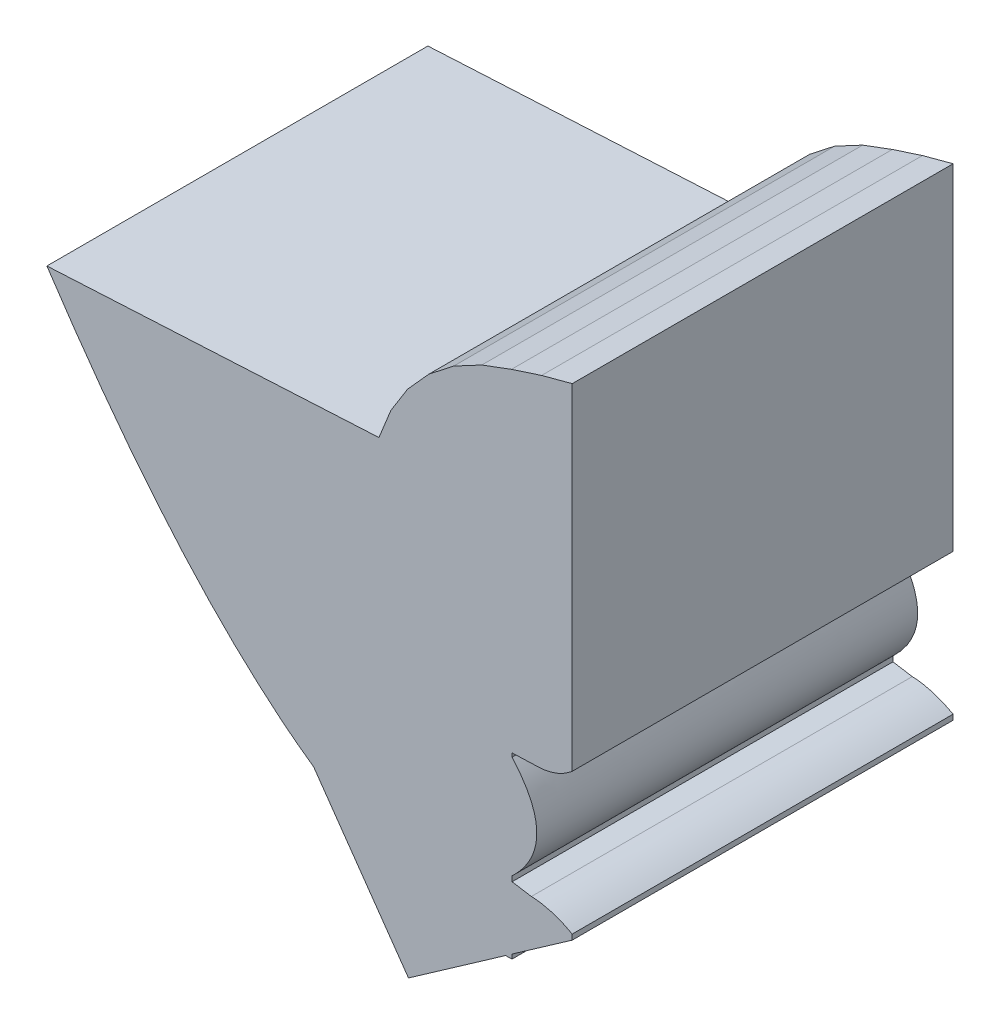
ISO-10303-21;
HEADER;
FILE_DESCRIPTION(('STEP AP214'),'2;1');
FILE_NAME('part.step','',(''),(''),'','','');
FILE_SCHEMA(('AUTOMOTIVE_DESIGN { 1 0 10303 214 1 1 1 1 }'));
ENDSEC;
DATA;
#1=APPLICATION_CONTEXT('core data for automotive mechanical design processes');
#2=APPLICATION_PROTOCOL_DEFINITION('international standard','automotive_design',2000,#1);
#3=PRODUCT_CONTEXT('',#1,'mechanical');
#4=PRODUCT('Part','Part','',(#3));
#5=PRODUCT_RELATED_PRODUCT_CATEGORY('part','',(#4));
#6=PRODUCT_DEFINITION_FORMATION('','',#4);
#7=PRODUCT_DEFINITION_CONTEXT('part definition',#1,'design');
#8=PRODUCT_DEFINITION('design','',#6,#7);
#9=PRODUCT_DEFINITION_SHAPE('','',#8);
#10=(LENGTH_UNIT() NAMED_UNIT(*) SI_UNIT(.MILLI.,.METRE.));
#11=(NAMED_UNIT(*) PLANE_ANGLE_UNIT() SI_UNIT($,.RADIAN.));
#12=(NAMED_UNIT(*) SI_UNIT($,.STERADIAN.) SOLID_ANGLE_UNIT());
#13=UNCERTAINTY_MEASURE_WITH_UNIT(LENGTH_MEASURE(1.E-05),#10,'distance_accuracy_value','');
#14=(GEOMETRIC_REPRESENTATION_CONTEXT(3) GLOBAL_UNCERTAINTY_ASSIGNED_CONTEXT((#13)) GLOBAL_UNIT_ASSIGNED_CONTEXT((#10,
#11,#12)) REPRESENTATION_CONTEXT('',''));
#15=CARTESIAN_POINT('',(0.,0.,0.));
#16=DIRECTION('',(0.,0.,1.));
#17=DIRECTION('',(1.,0.,0.));
#18=AXIS2_PLACEMENT_3D('',#15,#16,#17);
#19=CARTESIAN_POINT('',(-2.17733041778456,0.,7.21));
#20=DIRECTION('',(1.,0.,0.));
#21=DIRECTION('',(0.,1.,0.));
#22=AXIS2_PLACEMENT_3D('',#19,#20,#21);
#23=PLANE('',#22);
#24=DIRECTION('',(0.,1.,0.));
#25=VECTOR('',#24,1.);
#26=CARTESIAN_POINT('',(-2.17733041778456,0.,7.21));
#27=LINE('',#26,#25);
#28=CARTESIAN_POINT('',(-2.17733041779455,-1.68817652024789,7.21));
#29=VERTEX_POINT('',#28);
#30=CARTESIAN_POINT('',(-2.17733041778456,-1.88283284648762,7.21));
#31=VERTEX_POINT('',#30);
#32=EDGE_CURVE('E339',#29,#31,#27,.F.);
#33=ORIENTED_EDGE('',*,*,#32,.T.);
#34=DIRECTION('',(0.,0.,-1.));
#35=VECTOR('',#34,1.);
#36=CARTESIAN_POINT('',(-2.17733041778456,-1.88283284648762,7.21));
#37=LINE('',#36,#35);
#38=CARTESIAN_POINT('',(-2.17733041778456,-1.88283284648762,-7.21));
#39=VERTEX_POINT('',#38);
#40=EDGE_CURVE('E13',#31,#39,#37,.T.);
#41=ORIENTED_EDGE('',*,*,#40,.T.);
#42=DIRECTION('',(0.,1.,0.));
#43=VECTOR('',#42,1.);
#44=CARTESIAN_POINT('',(-2.17733041778456,0.,-7.21));
#45=LINE('',#44,#43);
#46=CARTESIAN_POINT('',(-2.17733041778456,-1.68817652020115,-7.21));
#47=VERTEX_POINT('',#46);
#48=EDGE_CURVE('E238',#47,#39,#45,.F.);
#49=ORIENTED_EDGE('',*,*,#48,.F.);
#50=DIRECTION('',(0.,0.,-1.));
#51=VECTOR('',#50,1.);
#52=CARTESIAN_POINT('',(-2.17733041778328,-1.68817652023794,30.8299178698776));
#53=LINE('',#52,#51);
#54=EDGE_CURVE('E627',#29,#47,#53,.T.);
#55=ORIENTED_EDGE('',*,*,#54,.F.);
#56=EDGE_LOOP('',(#33,#41,#49,#55));
#57=FACE_BOUND('',#56,.T.);
#58=ADVANCED_FACE('F59',(#57),#23,.T.);
#59=CARTESIAN_POINT('',(-2.17733041778456,-4.25341499115486,-7.21));
#60=VERTEX_POINT('',#59);
#61=CARTESIAN_POINT('',(-2.17733041883694,-4.4181521924004,-7.21253661769719));
#62=VERTEX_POINT('',#61);
#63=EDGE_CURVE('E312',#60,#62,#45,.F.);
#64=ORIENTED_EDGE('',*,*,#63,.F.);
#65=DIRECTION('',(0.,0.,1.));
#66=VECTOR('',#65,1.);
#67=CARTESIAN_POINT('',(-2.17733041778456,-4.25341499115486,7.21));
#68=LINE('',#67,#66);
#69=CARTESIAN_POINT('',(-2.17733041778456,-4.25341499115486,7.21));
#70=VERTEX_POINT('',#69);
#71=EDGE_CURVE('E273',#60,#70,#68,.T.);
#72=ORIENTED_EDGE('',*,*,#71,.T.);
#73=CARTESIAN_POINT('',(-2.17733041778728,-4.418152192393,7.21251805157701));
#74=VERTEX_POINT('',#73);
#75=EDGE_CURVE('E317',#70,#74,#27,.F.);
#76=ORIENTED_EDGE('',*,*,#75,.T.);
#77=DIRECTION('',(0.,0.,1.));
#78=VECTOR('',#77,1.);
#79=CARTESIAN_POINT('',(-2.17733041988932,-4.41815219245795,-7.21507323539439));
#80=LINE('',#79,#78);
#81=EDGE_CURVE('E543',#62,#74,#80,.T.);
#82=ORIENTED_EDGE('',*,*,#81,.F.);
#83=EDGE_LOOP('',(#64,#72,#76,#82));
#84=FACE_BOUND('',#83,.T.);
#85=ADVANCED_FACE('F370',(#84),#23,.T.);
#86=CARTESIAN_POINT('',(-82931.1005830976,996560.072871644,30.8299178698776));
#87=CARTESIAN_POINT('',(87153.8887538027,-996199.093812144,30.8299178698776));
#88=CARTESIAN_POINT('',(-91384.0928999308,995820.531871049,30.8299178698776));
#89=B_SPLINE_CURVE_WITH_KNOTS('',2,(#86,#87,#88),.UNSPECIFIED.,.F.,.F.,(3,3),(0.,1.),.UNSPECIFIED.);
#90=DIRECTION('',(0.,0.,-1.));
#91=VECTOR('',#90,1.);
#92=SURFACE_OF_LINEAR_EXTRUSION('',#89,#91);
#93=CARTESIAN_POINT('',(-10.3360060158809,-1.39847805226501,-7.21000000000001));
#94=CARTESIAN_POINT('',(-10.0127759331226,-1.64468664875738,-7.21));
#95=CARTESIAN_POINT('',(-9.6912952647259,-1.87089934759743,-7.21));
#96=B_SPLINE_CURVE_WITH_KNOTS('',2,(#93,#94,#95),.UNSPECIFIED.,.F.,.F.,(3,3),(0.500894186665394,
0.500965025000237),.UNSPECIFIED.);
#97=CARTESIAN_POINT('',(-10.3360060158632,-1.39847805228234,-7.2125366176972));
#98=VERTEX_POINT('',#97);
#99=CARTESIAN_POINT('',(-9.69129526449503,-1.87089934768793,-7.21));
#100=VERTEX_POINT('',#99);
#101=EDGE_CURVE('E306',#98,#100,#96,.T.);
#102=ORIENTED_EDGE('',*,*,#101,.T.);
#103=DIRECTION('',(0.,0.,-1.));
#104=VECTOR('',#103,1.);
#105=CARTESIAN_POINT('',(-9.69129526437307,-1.87089934786155,0.));
#106=LINE('',#105,#104);
#107=CARTESIAN_POINT('',(-9.69129526445234,-1.8708993477489,7.21));
#108=VERTEX_POINT('',#107);
#109=EDGE_CURVE('E65',#100,#108,#106,.F.);
#110=ORIENTED_EDGE('',*,*,#109,.T.);
#111=CARTESIAN_POINT('',(-9.69129526465307,-1.8708993476545,7.21));
#112=CARTESIAN_POINT('',(-10.0127759330863,-1.64468664879094,7.21));
#113=CARTESIAN_POINT('',(-10.3360060158816,-1.3984780522705,7.21));
#114=B_SPLINE_CURVE_WITH_KNOTS('',2,(#111,#112,#113),.UNSPECIFIED.,.F.,.F.,(3,3),
(0.500894186665386,0.500965025000236),.UNSPECIFIED.);
#115=CARTESIAN_POINT('',(-10.3360060158816,-1.39847805227263,7.21251805157951));
#116=VERTEX_POINT('',#115);
#117=EDGE_CURVE('E474',#116,#108,#114,.F.);
#118=ORIENTED_EDGE('',*,*,#117,.F.);
#119=CARTESIAN_POINT('',(-10.336006015861,-1.39847805228632,7.21));
#120=CARTESIAN_POINT('',(-10.6228848167366,-1.17995870432205,7.21));
#121=CARTESIAN_POINT('',(-10.9111416710362,-0.945688133646021,7.21));
#122=B_SPLINE_CURVE_WITH_KNOTS('',2,(#119,#120,#121),.UNSPECIFIED.,.F.,.F.,(3,3),
(0.500965025000234,0.501027896674745),.UNSPECIFIED.);
#123=CARTESIAN_POINT('',(-10.9111416711035,-0.945688133586594,7.21251805157951));
#124=VERTEX_POINT('',#123);
#125=EDGE_CURVE('E333',#124,#116,#122,.F.);
#126=ORIENTED_EDGE('',*,*,#125,.F.);
#127=CARTESIAN_POINT('',(-10.9111416711694,-0.945688133531575,7.21));
#128=CARTESIAN_POINT('',(-15.1971813204195,2.53763911301365,7.21));
#129=CARTESIAN_POINT('',(-19.7878835648669,9.50327575735757,7.21));
#130=B_SPLINE_CURVE_WITH_KNOTS('',2,(#127,#128,#129),.UNSPECIFIED.,.F.,.F.,(3,3),
(0.501027896674761,0.501962724366634),.UNSPECIFIED.);
#131=CARTESIAN_POINT('',(-19.7878835648708,9.50327575735899,7.21251805157951));
#132=VERTEX_POINT('',#131);
#133=EDGE_CURVE('E346',#132,#124,#130,.F.);
#134=ORIENTED_EDGE('',*,*,#133,.F.);
#135=DIRECTION('',(0.,0.,1.));
#136=VECTOR('',#135,1.);
#137=CARTESIAN_POINT('',(-19.7878835648708,9.50327575735899,-7.21507323539439));
#138=LINE('',#137,#136);
#139=CARTESIAN_POINT('',(-19.7878835648708,9.50327575735899,-7.21253661769719));
#140=VERTEX_POINT('',#139);
#141=EDGE_CURVE('E472',#140,#132,#138,.T.);
#142=ORIENTED_EDGE('',*,*,#141,.F.);
#143=CARTESIAN_POINT('',(-19.7878835648714,9.50327575734023,-7.21));
#144=CARTESIAN_POINT('',(-15.197181319061,2.53763911092818,-7.21));
#145=CARTESIAN_POINT('',(-10.9111416686287,-0.945688135617351,-7.21));
#146=B_SPLINE_CURVE_WITH_KNOTS('',2,(#143,#144,#145),.UNSPECIFIED.,.F.,.F.,(3,3),
(0.501027896674483,0.501962724366634),.UNSPECIFIED.);
#147=CARTESIAN_POINT('',(-10.9111416684846,-0.945688135711886,-7.21253661769719));
#148=VERTEX_POINT('',#147);
#149=EDGE_CURVE('E466',#140,#148,#146,.T.);
#150=ORIENTED_EDGE('',*,*,#149,.T.);
#151=CARTESIAN_POINT('',(-10.9111416684921,-0.945688135713634,-7.21));
#152=CARTESIAN_POINT('',(-10.6228848154707,-1.17995870528634,-7.21));
#153=CARTESIAN_POINT('',(-10.336006015861,-1.39847805228632,-7.21));
#154=B_SPLINE_CURVE_WITH_KNOTS('',2,(#151,#152,#153),.UNSPECIFIED.,.F.,.F.,(3,3),
(0.500965025000234,0.501027896674468),.UNSPECIFIED.);
#155=EDGE_CURVE('E314',#148,#98,#154,.T.);
#156=ORIENTED_EDGE('',*,*,#155,.T.);
#157=EDGE_LOOP('',(#102,#110,#118,#126,#134,#142,#150,#156));
#158=FACE_BOUND('',#157,.T.);
#159=ADVANCED_FACE('F353',(#158),#92,.T.);
#160=CARTESIAN_POINT('',(-2.17733041779322,-4.41815219232809,7.21));
#161=CARTESIAN_POINT('',(-2.30147491297289,-4.42452331167611,7.21));
#162=CARTESIAN_POINT('',(-2.42591830274587,-4.42747805018959,7.21000000000001));
#163=B_SPLINE_CURVE_WITH_KNOTS('',2,(#160,#161,#162),.UNSPECIFIED.,.F.,.F.,(3,3),
(0.500038190982026,0.500067471653357),.UNSPECIFIED.);
#164=CARTESIAN_POINT('',(-2.42591825101476,-4.42747806589003,7.21));
#165=VERTEX_POINT('',#164);
#166=EDGE_CURVE('E453',#165,#74,#163,.F.);
#167=ORIENTED_EDGE('',*,*,#166,.F.);
#168=DIRECTION('',(0.,0.,-1.));
#169=VECTOR('',#168,1.);
#170=CARTESIAN_POINT('',(-2.42591822599092,-4.4274780483995,0.));
#171=LINE('',#170,#169);
#172=CARTESIAN_POINT('',(-2.4259183062176,-4.42747805030233,-7.21));
#173=VERTEX_POINT('',#172);
#174=EDGE_CURVE('E302',#165,#173,#171,.T.);
#175=ORIENTED_EDGE('',*,*,#174,.T.);
#176=CARTESIAN_POINT('',(-2.42591830621543,-4.4274780502943,-7.21));
#177=CARTESIAN_POINT('',(-2.30147491575363,-4.42452331181219,-7.21));
#178=CARTESIAN_POINT('',(-2.17733041988843,-4.41815219245793,-7.21));
#179=B_SPLINE_CURVE_WITH_KNOTS('',2,(#176,#177,#178),.UNSPECIFIED.,.F.,.F.,(3,3),
(0.500038190982273,0.500067471653765),.UNSPECIFIED.);
#180=EDGE_CURVE('E292',#173,#62,#179,.T.);
#181=ORIENTED_EDGE('',*,*,#180,.T.);
#182=ORIENTED_EDGE('',*,*,#81,.T.);
#183=EDGE_LOOP('',(#167,#175,#181,#182));
#184=FACE_BOUND('',#183,.T.);
#185=ADVANCED_FACE('F366',(#184),#92,.T.);
#186=DIRECTION('',(0.,1.,0.));
#187=VECTOR('',#186,1.);
#188=CARTESIAN_POINT('',(-2.17733041778456,0.,-7.21));
#189=LINE('',#188,#187);
#190=CARTESIAN_POINT('',(-2.17733041778456,2.34248700715526,-7.21));
#191=VERTEX_POINT('',#190);
#192=CARTESIAN_POINT('',(-2.17733041777607,2.20172974209443,-7.21));
#193=VERTEX_POINT('',#192);
#194=EDGE_CURVE('E330',#191,#193,#189,.F.);
#195=ORIENTED_EDGE('',*,*,#194,.F.);
#196=DIRECTION('',(0.,0.,-1.));
#197=VECTOR('',#196,1.);
#198=CARTESIAN_POINT('',(-2.17733041778456,2.34248700715526,24.0565253000013));
#199=LINE('',#198,#197);
#200=CARTESIAN_POINT('',(-2.17733041778456,2.34248700715526,7.21));
#201=VERTEX_POINT('',#200);
#202=EDGE_CURVE('E533',#201,#191,#199,.T.);
#203=ORIENTED_EDGE('',*,*,#202,.F.);
#204=DIRECTION('',(0.,1.,0.));
#205=VECTOR('',#204,1.);
#206=CARTESIAN_POINT('',(-2.17733041778456,0.,7.21));
#207=LINE('',#206,#205);
#208=CARTESIAN_POINT('',(-2.17733041778074,2.20172974210003,7.21));
#209=VERTEX_POINT('',#208);
#210=EDGE_CURVE('E337',#201,#209,#207,.F.);
#211=ORIENTED_EDGE('',*,*,#210,.T.);
#212=DIRECTION('',(0.,0.,-1.));
#213=VECTOR('',#212,1.);
#214=CARTESIAN_POINT('',(-2.17733041778074,2.20172974210003,30.8299178698776));
#215=LINE('',#214,#213);
#216=EDGE_CURVE('E616',#209,#193,#215,.T.);
#217=ORIENTED_EDGE('',*,*,#216,.T.);
#218=EDGE_LOOP('',(#195,#203,#211,#217));
#219=FACE_BOUND('',#218,.T.);
#220=ADVANCED_FACE('F596',(#219),#23,.T.);
#221=CARTESIAN_POINT('',(0.,0.,7.21));
#222=DIRECTION('',(0.,0.,1.));
#223=DIRECTION('',(1.,0.,0.));
#224=AXIS2_PLACEMENT_3D('',#221,#222,#223);
#225=PLANE('',#224);
#226=ORIENTED_EDGE('',*,*,#75,.F.);
#227=DIRECTION('',(0.81915204428873,0.57357643635142,0.));
#228=VECTOR('',#227,1.);
#229=CARTESIAN_POINT('',(0.100000000004221,-2.65881106562334,7.21));
#230=LINE('',#229,#228);
#231=CARTESIAN_POINT('',(0.100000000004221,-2.65881106562334,7.21));
#232=VERTEX_POINT('',#231);
#233=EDGE_CURVE('E75',#70,#232,#230,.T.);
#234=ORIENTED_EDGE('',*,*,#233,.T.);
#235=DIRECTION('',(-1.62011653008151E-11,1.,0.));
#236=VECTOR('',#235,1.);
#237=CARTESIAN_POINT('',(0.100000000000981,-2.45881106562334,7.21));
#238=LINE('',#237,#236);
#239=CARTESIAN_POINT('',(0.100000000000981,-2.45881106562334,7.21));
#240=VERTEX_POINT('',#239);
#241=EDGE_CURVE('E677',#232,#240,#238,.T.);
#242=ORIENTED_EDGE('',*,*,#241,.T.);
#243=CARTESIAN_POINT('',(-15004.7897636461,-999892.444646946,7.21));
#244=CARTESIAN_POINT('',(17450.906437277,999845.695156391,7.21));
#245=CARTESIAN_POINT('',(-19903.023110908,-999806.945665836,7.21));
#246=B_SPLINE_CURVE_WITH_KNOTS('',2,(#243,#244,#245),.UNSPECIFIED.,.F.,.F.,(3,3),(0.,1.),.UNSPECIFIED.);
#247=CARTESIAN_POINT('',(-1.44765075676889,-2.00137084805176,7.21));
#248=VERTEX_POINT('',#247);
#249=EDGE_CURVE('E683',#240,#248,#246,.T.);
#250=ORIENTED_EDGE('',*,*,#249,.T.);
#251=DIRECTION('',(-0.987060217140431,0.160350016335155,0.));
#252=VECTOR('',#251,1.);
#253=CARTESIAN_POINT('',(-1.44765075676889,-2.00137084805176,7.21));
#254=LINE('',#253,#252);
#255=EDGE_CURVE('E246',#248,#31,#254,.T.);
#256=ORIENTED_EDGE('',*,*,#255,.T.);
#257=ORIENTED_EDGE('',*,*,#32,.F.);
#258=CARTESIAN_POINT('',(-2.17733041777607,2.20172974209443,7.21));
#259=CARTESIAN_POINT('',(-0.307419303310444,0.0931805865995528,7.21));
#260=CARTESIAN_POINT('',(-2.17733041779435,-1.68817652026,7.21));
#261=B_SPLINE_CURVE_WITH_KNOTS('',2,(#258,#259,#260),.UNSPECIFIED.,.F.,.F.,(3,3),
(0.49947186766891,0.500440643667569),.UNSPECIFIED.);
#262=EDGE_CURVE('E650',#209,#29,#261,.T.);
#263=ORIENTED_EDGE('',*,*,#262,.F.);
#264=ORIENTED_EDGE('',*,*,#210,.F.);
#265=DIRECTION('',(0.999390827019096,0.0348994967025048,0.));
#266=VECTOR('',#265,1.);
#267=CARTESIAN_POINT('',(-2.17733041778456,2.34248700715526,7.21));
#268=LINE('',#267,#266);
#269=CARTESIAN_POINT('',(-1.19050164048462,2.37694782742692,7.21000000000002));
#270=VERTEX_POINT('',#269);
#271=EDGE_CURVE('E480',#201,#270,#268,.T.);
#272=ORIENTED_EDGE('',*,*,#271,.T.);
#273=CARTESIAN_POINT('',(-343900.072311573,939011.080499257,7.21000000000001));
#274=CARTESIAN_POINT('',(342019.599581338,-939690.120785908,7.21000000000001));
#275=CARTESIAN_POINT('',(-340141.301828429,940379.16107256,7.21000000000001));
#276=B_SPLINE_CURVE_WITH_KNOTS('',2,(#273,#274,#275),.UNSPECIFIED.,.F.,.F.,(3,3),(0.,1.),.UNSPECIFIED.);
#277=CARTESIAN_POINT('',(0.100000000004221,2.87767341815847,7.21000000000001));
#278=VERTEX_POINT('',#277);
#279=EDGE_CURVE('E475',#270,#278,#276,.T.);
#280=ORIENTED_EDGE('',*,*,#279,.T.);
#281=DIRECTION('',(0.,1.,0.));
#282=VECTOR('',#281,1.);
#283=CARTESIAN_POINT('',(0.100000000004221,2.87767341815847,7.21));
#284=LINE('',#283,#282);
#285=CARTESIAN_POINT('',(0.100000000004747,15.587903347272,7.21));
#286=VERTEX_POINT('',#285);
#287=EDGE_CURVE('E513',#278,#286,#284,.T.);
#288=ORIENTED_EDGE('',*,*,#287,.T.);
#289=DIRECTION('',(-0.96592582628907,-0.258819045102515,0.));
#290=VECTOR('',#289,1.);
#291=CARTESIAN_POINT('',(-1.05911099154214,15.277320493149,7.21));
#292=LINE('',#291,#290);
#293=CARTESIAN_POINT('',(-1.05911099154214,15.277320493149,7.21000000000001));
#294=VERTEX_POINT('',#293);
#295=EDGE_CURVE('E515',#286,#294,#292,.T.);
#296=ORIENTED_EDGE('',*,*,#295,.T.);
#297=DIRECTION('',(-0.951056516295155,-0.309016994374943,0.));
#298=VECTOR('',#297,1.);
#299=CARTESIAN_POINT('',(-2.20037881109632,14.906500099899,7.21));
#300=LINE('',#299,#298);
#301=CARTESIAN_POINT('',(-2.20037881109632,14.906500099899,7.21000000000001));
#302=VERTEX_POINT('',#301);
#303=EDGE_CURVE('E508',#294,#302,#300,.T.);
#304=ORIENTED_EDGE('',*,*,#303,.T.);
#305=DIRECTION('',(-0.9366721892484,-0.350207381259461,0.));
#306=VECTOR('',#305,1.);
#307=CARTESIAN_POINT('',(-3.3243854381944,14.4862512423877,7.21));
#308=LINE('',#307,#306);
#309=CARTESIAN_POINT('',(-3.3243854381944,14.4862512423877,7.21000000000001));
#310=VERTEX_POINT('',#309);
#311=EDGE_CURVE('E506',#302,#310,#308,.T.);
#312=ORIENTED_EDGE('',*,*,#311,.T.);
#313=DIRECTION('',(-0.882947592859007,-0.46947156278574,0.));
#314=VECTOR('',#313,1.);
#315=CARTESIAN_POINT('',(-4.38392254962521,13.9228853670448,7.21));
#316=LINE('',#315,#314);
#317=CARTESIAN_POINT('',(-4.38392254962521,13.9228853670448,7.21000000000001));
#318=VERTEX_POINT('',#317);
#319=EDGE_CURVE('E503',#310,#318,#316,.T.);
#320=ORIENTED_EDGE('',*,*,#319,.T.);
#321=DIRECTION('',(-0.788010753606726,-0.615661475325654,0.));
#322=VECTOR('',#321,1.);
#323=CARTESIAN_POINT('',(-5.32953545395328,13.184091596654,7.21));
#324=LINE('',#323,#322);
#325=CARTESIAN_POINT('',(-5.32953545395328,13.184091596654,7.21000000000001));
#326=VERTEX_POINT('',#325);
#327=EDGE_CURVE('E499',#318,#326,#324,.T.);
#328=ORIENTED_EDGE('',*,*,#327,.T.);
#329=DIRECTION('',(-0.669130606358526,-0.743144825477694,0.));
#330=VECTOR('',#329,1.);
#331=CARTESIAN_POINT('',(-6.13249218158351,12.2923178060808,7.21));
#332=LINE('',#331,#330);
#333=CARTESIAN_POINT('',(-6.13249218158351,12.2923178060808,7.21000000000001));
#334=VERTEX_POINT('',#333);
#335=EDGE_CURVE('E500',#326,#334,#332,.T.);
#336=ORIENTED_EDGE('',*,*,#335,.T.);
#337=DIRECTION('',(-0.52991926423321,-0.848048096156423,0.));
#338=VECTOR('',#337,1.);
#339=CARTESIAN_POINT('',(-6.76839529866336,11.2746600906931,7.21));
#340=LINE('',#339,#338);
#341=CARTESIAN_POINT('',(-6.76839529866336,11.2746600906931,7.21000000000001));
#342=VERTEX_POINT('',#341);
#343=EDGE_CURVE('E494',#334,#342,#340,.T.);
#344=ORIENTED_EDGE('',*,*,#343,.T.);
#345=DIRECTION('',(-0.374606593415918,-0.927183854566785,0.));
#346=VECTOR('',#345,1.);
#347=CARTESIAN_POINT('',(-7.21792321076246,10.1620394652129,7.21));
#348=LINE('',#347,#346);
#349=CARTESIAN_POINT('',(-7.21792321076246,10.1620394652129,7.21000000000001));
#350=VERTEX_POINT('',#349);
#351=EDGE_CURVE('E484',#342,#350,#348,.T.);
#352=ORIENTED_EDGE('',*,*,#351,.T.);
#353=DIRECTION('',(-0.998629534754494,-0.0523359562444688,0.));
#354=VECTOR('',#353,1.);
#355=CARTESIAN_POINT('',(-10.3098203952063,10.,7.21));
#356=LINE('',#355,#354);
#357=EDGE_CURVE('E325',#350,#132,#356,.T.);
#358=ORIENTED_EDGE('',*,*,#357,.T.);
#359=ORIENTED_EDGE('',*,*,#133,.T.);
#360=ORIENTED_EDGE('',*,*,#125,.T.);
#361=ORIENTED_EDGE('',*,*,#117,.T.);
#362=DIRECTION('',(0.573576436350946,-0.819152044289062,0.));
#363=VECTOR('',#362,1.);
#364=CARTESIAN_POINT('',(-10.6462844999228,-0.507033374651204,7.21));
#365=LINE('',#364,#363);
#366=CARTESIAN_POINT('',(-6.09986032351071,-7.,7.21));
#367=VERTEX_POINT('',#366);
#368=EDGE_CURVE('E276',#108,#367,#365,.T.);
#369=ORIENTED_EDGE('',*,*,#368,.T.);
#370=EDGE_CURVE('E275',#367,#165,#230,.T.);
#371=ORIENTED_EDGE('',*,*,#370,.T.);
#372=ORIENTED_EDGE('',*,*,#166,.T.);
#373=EDGE_LOOP('',(#226,#234,#242,#250,#256,#257,#263,#264,#272,#280,#288,#296,#304,#312,#320,
#328,#336,#344,#352,#358,#359,#360,#361,#369,#371,#372));
#374=FACE_BOUND('',#373,.T.);
#375=ADVANCED_FACE('F428',(#374),#225,.T.);
#376=CARTESIAN_POINT('',(0.,0.,-7.21));
#377=DIRECTION('',(0.,0.,1.));
#378=DIRECTION('',(1.,0.,0.));
#379=AXIS2_PLACEMENT_3D('',#376,#377,#378);
#380=PLANE('',#379);
#381=ORIENTED_EDGE('',*,*,#48,.T.);
#382=DIRECTION('',(0.987060217140431,-0.160350016335155,0.));
#383=VECTOR('',#382,1.);
#384=CARTESIAN_POINT('',(-1.44765075676889,-2.00137084805176,-7.21));
#385=LINE('',#384,#383);
#386=CARTESIAN_POINT('',(-1.44765075676889,-2.00137084805176,-7.21));
#387=VERTEX_POINT('',#386);
#388=EDGE_CURVE('E229',#39,#387,#385,.T.);
#389=ORIENTED_EDGE('',*,*,#388,.T.);
#390=CARTESIAN_POINT('',(-15004.7897636461,-999892.444646946,-7.21));
#391=CARTESIAN_POINT('',(17450.906437277,999845.695156391,-7.21));
#392=CARTESIAN_POINT('',(-19903.023110908,-999806.945665836,-7.21));
#393=B_SPLINE_CURVE_WITH_KNOTS('',2,(#390,#391,#392),.UNSPECIFIED.,.F.,.F.,(3,3),(0.,1.),.UNSPECIFIED.);
#394=CARTESIAN_POINT('',(0.100000000000981,-2.45881106562334,-7.21));
#395=VERTEX_POINT('',#394);
#396=EDGE_CURVE('E232',#387,#395,#393,.F.);
#397=ORIENTED_EDGE('',*,*,#396,.T.);
#398=DIRECTION('',(1.62011653008151E-11,-1.,0.));
#399=VECTOR('',#398,1.);
#400=CARTESIAN_POINT('',(0.100000000000981,-2.45881106562334,-7.21));
#401=LINE('',#400,#399);
#402=CARTESIAN_POINT('',(0.100000000004221,-2.65881106562334,-7.21));
#403=VERTEX_POINT('',#402);
#404=EDGE_CURVE('E254',#395,#403,#401,.T.);
#405=ORIENTED_EDGE('',*,*,#404,.T.);
#406=DIRECTION('',(-0.81915204428873,-0.57357643635142,0.));
#407=VECTOR('',#406,1.);
#408=CARTESIAN_POINT('',(0.100000000004221,-2.65881106562334,-7.21));
#409=LINE('',#408,#407);
#410=EDGE_CURVE('E253',#403,#60,#409,.T.);
#411=ORIENTED_EDGE('',*,*,#410,.T.);
#412=ORIENTED_EDGE('',*,*,#63,.T.);
#413=ORIENTED_EDGE('',*,*,#180,.F.);
#414=CARTESIAN_POINT('',(-6.09986032351071,-7.,-7.21));
#415=VERTEX_POINT('',#414);
#416=EDGE_CURVE('E78',#173,#415,#409,.T.);
#417=ORIENTED_EDGE('',*,*,#416,.T.);
#418=DIRECTION('',(-0.573576436350946,0.819152044289062,0.));
#419=VECTOR('',#418,1.);
#420=CARTESIAN_POINT('',(-10.6462844999228,-0.507033374651204,-7.21));
#421=LINE('',#420,#419);
#422=EDGE_CURVE('E279',#415,#100,#421,.T.);
#423=ORIENTED_EDGE('',*,*,#422,.T.);
#424=ORIENTED_EDGE('',*,*,#101,.F.);
#425=ORIENTED_EDGE('',*,*,#155,.F.);
#426=ORIENTED_EDGE('',*,*,#149,.F.);
#427=DIRECTION('',(-0.998629534754494,-0.0523359562444688,0.));
#428=VECTOR('',#427,1.);
#429=CARTESIAN_POINT('',(-0.550881453784725,10.5114443180936,-7.21));
#430=LINE('',#429,#428);
#431=CARTESIAN_POINT('',(-7.21792321076246,10.1620394652129,-7.21));
#432=VERTEX_POINT('',#431);
#433=EDGE_CURVE('E463',#432,#140,#430,.T.);
#434=ORIENTED_EDGE('',*,*,#433,.F.);
#435=DIRECTION('',(0.374606593415918,0.927183854566785,0.));
#436=VECTOR('',#435,1.);
#437=CARTESIAN_POINT('',(-7.21792321076246,10.1620394652129,-7.21));
#438=LINE('',#437,#436);
#439=CARTESIAN_POINT('',(-6.76839529866336,11.2746600906931,-7.21));
#440=VERTEX_POINT('',#439);
#441=EDGE_CURVE('E906',#432,#440,#438,.T.);
#442=ORIENTED_EDGE('',*,*,#441,.T.);
#443=DIRECTION('',(0.52991926423321,0.848048096156423,0.));
#444=VECTOR('',#443,1.);
#445=CARTESIAN_POINT('',(-6.76839529866336,11.2746600906931,-7.21));
#446=LINE('',#445,#444);
#447=CARTESIAN_POINT('',(-6.13249218158351,12.2923178060808,-7.21));
#448=VERTEX_POINT('',#447);
#449=EDGE_CURVE('E908',#440,#448,#446,.T.);
#450=ORIENTED_EDGE('',*,*,#449,.T.);
#451=DIRECTION('',(0.669130606358526,0.743144825477694,0.));
#452=VECTOR('',#451,1.);
#453=CARTESIAN_POINT('',(-6.13249218158351,12.2923178060808,-7.21));
#454=LINE('',#453,#452);
#455=CARTESIAN_POINT('',(-5.32953545395328,13.184091596654,-7.21));
#456=VERTEX_POINT('',#455);
#457=EDGE_CURVE('E914',#448,#456,#454,.T.);
#458=ORIENTED_EDGE('',*,*,#457,.T.);
#459=DIRECTION('',(0.788010753606726,0.615661475325654,0.));
#460=VECTOR('',#459,1.);
#461=CARTESIAN_POINT('',(-5.32953545395328,13.184091596654,-7.21));
#462=LINE('',#461,#460);
#463=CARTESIAN_POINT('',(-4.38392254962521,13.9228853670448,-7.21));
#464=VERTEX_POINT('',#463);
#465=EDGE_CURVE('E913',#456,#464,#462,.T.);
#466=ORIENTED_EDGE('',*,*,#465,.T.);
#467=DIRECTION('',(0.882947592859007,0.46947156278574,0.));
#468=VECTOR('',#467,1.);
#469=CARTESIAN_POINT('',(-4.38392254962521,13.9228853670448,-7.21));
#470=LINE('',#469,#468);
#471=CARTESIAN_POINT('',(-3.3243854381944,14.4862512423877,-7.21));
#472=VERTEX_POINT('',#471);
#473=EDGE_CURVE('E916',#464,#472,#470,.T.);
#474=ORIENTED_EDGE('',*,*,#473,.T.);
#475=DIRECTION('',(0.9366721892484,0.350207381259461,0.));
#476=VECTOR('',#475,1.);
#477=CARTESIAN_POINT('',(-3.3243854381944,14.4862512423877,-7.21));
#478=LINE('',#477,#476);
#479=CARTESIAN_POINT('',(-2.20037881109632,14.906500099899,-7.21000000000001));
#480=VERTEX_POINT('',#479);
#481=EDGE_CURVE('E892',#472,#480,#478,.T.);
#482=ORIENTED_EDGE('',*,*,#481,.T.);
#483=DIRECTION('',(0.951056516295155,0.309016994374943,0.));
#484=VECTOR('',#483,1.);
#485=CARTESIAN_POINT('',(-2.20037881109632,14.906500099899,-7.21));
#486=LINE('',#485,#484);
#487=CARTESIAN_POINT('',(-1.05911099154214,15.277320493149,-7.21));
#488=VERTEX_POINT('',#487);
#489=EDGE_CURVE('E487',#480,#488,#486,.T.);
#490=ORIENTED_EDGE('',*,*,#489,.T.);
#491=DIRECTION('',(0.96592582628907,0.258819045102515,0.));
#492=VECTOR('',#491,1.);
#493=CARTESIAN_POINT('',(-1.05911099154214,15.277320493149,-7.21));
#494=LINE('',#493,#492);
#495=CARTESIAN_POINT('',(0.100000000004747,15.587903347272,-7.21));
#496=VERTEX_POINT('',#495);
#497=EDGE_CURVE('E890',#488,#496,#494,.T.);
#498=ORIENTED_EDGE('',*,*,#497,.T.);
#499=DIRECTION('',(0.,-1.,0.));
#500=VECTOR('',#499,1.);
#501=CARTESIAN_POINT('',(0.100000000004221,2.87767341815847,-7.21));
#502=LINE('',#501,#500);
#503=CARTESIAN_POINT('',(0.0999999999995449,2.8776734181557,-7.21000000000001));
#504=VERTEX_POINT('',#503);
#505=EDGE_CURVE('E894',#496,#504,#502,.T.);
#506=ORIENTED_EDGE('',*,*,#505,.T.);
#507=CARTESIAN_POINT('',(-343900.072311573,939011.080499257,-7.21000000000001));
#508=CARTESIAN_POINT('',(342019.599581338,-939690.120785908,-7.21000000000001));
#509=CARTESIAN_POINT('',(-340141.301828429,940379.16107256,-7.21000000000001));
#510=B_SPLINE_CURVE_WITH_KNOTS('',2,(#507,#508,#509),.UNSPECIFIED.,.F.,.F.,(3,3),(0.,1.),.UNSPECIFIED.);
#511=CARTESIAN_POINT('',(-1.19050164048462,2.37694782741517,-7.21));
#512=VERTEX_POINT('',#511);
#513=EDGE_CURVE('E896',#504,#512,#510,.F.);
#514=ORIENTED_EDGE('',*,*,#513,.T.);
#515=DIRECTION('',(-0.999390827019096,-0.0348994967025048,0.));
#516=VECTOR('',#515,1.);
#517=CARTESIAN_POINT('',(-2.17733041778456,2.34248700715526,-7.21));
#518=LINE('',#517,#516);
#519=EDGE_CURVE('E622',#512,#191,#518,.T.);
#520=ORIENTED_EDGE('',*,*,#519,.T.);
#521=ORIENTED_EDGE('',*,*,#194,.T.);
#522=CARTESIAN_POINT('',(-2.17733041776379,-1.68817652023098,-7.21));
#523=CARTESIAN_POINT('',(-0.307419303328964,0.0931805866132554,-7.21));
#524=CARTESIAN_POINT('',(-2.17733041776824,2.20172974208621,-7.21));
#525=B_SPLINE_CURVE_WITH_KNOTS('',2,(#522,#523,#524),.UNSPECIFIED.,.F.,.F.,(3,3),
(0.499471867668912,0.500440643667561),.UNSPECIFIED.);
#526=EDGE_CURVE('E623',#47,#193,#525,.T.);
#527=ORIENTED_EDGE('',*,*,#526,.F.);
#528=EDGE_LOOP('',(#381,#389,#397,#405,#411,#412,#413,#417,#423,#424,#425,#426,#434,#442,#450,
#458,#466,#474,#482,#490,#498,#506,#514,#520,#521,#527));
#529=FACE_BOUND('',#528,.T.);
#530=ADVANCED_FACE('F235',(#529),#380,.F.);
#531=CARTESIAN_POINT('',(-996021.636606251,89148.1321438377,30.8299178698776));
#532=CARTESIAN_POINT('',(996193.448091746,-87155.7427476542,30.8299178698776));
#533=CARTESIAN_POINT('',(-996370.259577241,85163.3533514707,30.8299178698776));
#534=B_SPLINE_CURVE_WITH_KNOTS('',2,(#531,#532,#533),.UNSPECIFIED.,.F.,.F.,(3,3),(0.,1.),.UNSPECIFIED.);
#535=DIRECTION('',(0.,0.,-1.));
#536=VECTOR('',#535,1.);
#537=SURFACE_OF_LINEAR_EXTRUSION('',#534,#536);
#538=ORIENTED_EDGE('',*,*,#216,.F.);
#539=ORIENTED_EDGE('',*,*,#262,.T.);
#540=ORIENTED_EDGE('',*,*,#54,.T.);
#541=ORIENTED_EDGE('',*,*,#526,.T.);
#542=EDGE_LOOP('',(#538,#539,#540,#541));
#543=FACE_BOUND('',#542,.T.);
#544=ADVANCED_FACE('F369',(#543),#537,.T.);
#545=CARTESIAN_POINT('',(-19.7878835648708,9.50327575735899,-7.21507323539439));
#546=DIRECTION('',(-0.0523359562444688,0.998629534754494,0.));
#547=DIRECTION('',(-0.998629534754494,-0.0523359562444688,0.));
#548=AXIS2_PLACEMENT_3D('',#545,#546,#547);
#549=PLANE('',#548);
#550=ORIENTED_EDGE('',*,*,#357,.F.);
#551=DIRECTION('',(0.,0.,-1.));
#552=VECTOR('',#551,1.);
#553=CARTESIAN_POINT('',(-7.21792321076246,10.1620394652129,24.0565253000013));
#554=LINE('',#553,#552);
#555=EDGE_CURVE('E531',#350,#432,#554,.T.);
#556=ORIENTED_EDGE('',*,*,#555,.T.);
#557=ORIENTED_EDGE('',*,*,#433,.T.);
#558=ORIENTED_EDGE('',*,*,#141,.T.);
#559=EDGE_LOOP('',(#550,#556,#557,#558));
#560=FACE_BOUND('',#559,.T.);
#561=ADVANCED_FACE('F368',(#560),#549,.T.);
#562=CARTESIAN_POINT('',(-1.05911099154214,15.277320493149,24.0565253000013));
#563=DIRECTION('',(0.258819045102515,-0.96592582628907,0.));
#564=DIRECTION('',(0.96592582628907,0.258819045102515,0.));
#565=AXIS2_PLACEMENT_3D('',#562,#563,#564);
#566=PLANE('',#565);
#567=ORIENTED_EDGE('',*,*,#295,.F.);
#568=DIRECTION('',(0.,0.,-1.));
#569=VECTOR('',#568,1.);
#570=CARTESIAN_POINT('',(0.100000000004747,15.587903347272,24.0565253000013));
#571=LINE('',#570,#569);
#572=EDGE_CURVE('E522',#286,#496,#571,.T.);
#573=ORIENTED_EDGE('',*,*,#572,.T.);
#574=ORIENTED_EDGE('',*,*,#497,.F.);
#575=DIRECTION('',(0.,0.,-1.));
#576=VECTOR('',#575,1.);
#577=CARTESIAN_POINT('',(-1.05911099154214,15.277320493149,24.0565253000013));
#578=LINE('',#577,#576);
#579=EDGE_CURVE('E519',#294,#488,#578,.T.);
#580=ORIENTED_EDGE('',*,*,#579,.F.);
#581=EDGE_LOOP('',(#567,#573,#574,#580));
#582=FACE_BOUND('',#581,.T.);
#583=ADVANCED_FACE('F590',(#582),#566,.F.);
#584=CARTESIAN_POINT('',(-2.20037881109632,14.906500099899,24.0565253000013));
#585=DIRECTION('',(0.309016994374943,-0.951056516295155,0.));
#586=DIRECTION('',(0.951056516295155,0.309016994374943,0.));
#587=AXIS2_PLACEMENT_3D('',#584,#585,#586);
#588=PLANE('',#587);
#589=ORIENTED_EDGE('',*,*,#303,.F.);
#590=ORIENTED_EDGE('',*,*,#579,.T.);
#591=ORIENTED_EDGE('',*,*,#489,.F.);
#592=DIRECTION('',(0.,0.,-1.));
#593=VECTOR('',#592,1.);
#594=CARTESIAN_POINT('',(-2.20037881109632,14.906500099899,24.0565253000013));
#595=LINE('',#594,#593);
#596=EDGE_CURVE('E520',#302,#480,#595,.T.);
#597=ORIENTED_EDGE('',*,*,#596,.F.);
#598=EDGE_LOOP('',(#589,#590,#591,#597));
#599=FACE_BOUND('',#598,.T.);
#600=ADVANCED_FACE('F585',(#599),#588,.F.);
#601=CARTESIAN_POINT('',(-3.3243854381944,14.4862512423877,24.0565253000013));
#602=DIRECTION('',(0.350207381259461,-0.9366721892484,0.));
#603=DIRECTION('',(0.9366721892484,0.350207381259461,0.));
#604=AXIS2_PLACEMENT_3D('',#601,#602,#603);
#605=PLANE('',#604);
#606=ORIENTED_EDGE('',*,*,#311,.F.);
#607=ORIENTED_EDGE('',*,*,#596,.T.);
#608=ORIENTED_EDGE('',*,*,#481,.F.);
#609=DIRECTION('',(0.,0.,-1.));
#610=VECTOR('',#609,1.);
#611=CARTESIAN_POINT('',(-3.3243854381944,14.4862512423877,24.0565253000013));
#612=LINE('',#611,#610);
#613=EDGE_CURVE('E525',#310,#472,#612,.T.);
#614=ORIENTED_EDGE('',*,*,#613,.F.);
#615=EDGE_LOOP('',(#606,#607,#608,#614));
#616=FACE_BOUND('',#615,.T.);
#617=ADVANCED_FACE('F581',(#616),#605,.F.);
#618=CARTESIAN_POINT('',(-4.38392254962521,13.9228853670448,24.0565253000013));
#619=DIRECTION('',(0.46947156278574,-0.882947592859007,0.));
#620=DIRECTION('',(0.882947592859007,0.46947156278574,0.));
#621=AXIS2_PLACEMENT_3D('',#618,#619,#620);
#622=PLANE('',#621);
#623=ORIENTED_EDGE('',*,*,#319,.F.);
#624=ORIENTED_EDGE('',*,*,#613,.T.);
#625=ORIENTED_EDGE('',*,*,#473,.F.);
#626=DIRECTION('',(0.,0.,-1.));
#627=VECTOR('',#626,1.);
#628=CARTESIAN_POINT('',(-4.38392254962521,13.9228853670448,24.0565253000013));
#629=LINE('',#628,#627);
#630=EDGE_CURVE('E523',#318,#464,#629,.T.);
#631=ORIENTED_EDGE('',*,*,#630,.F.);
#632=EDGE_LOOP('',(#623,#624,#625,#631));
#633=FACE_BOUND('',#632,.T.);
#634=ADVANCED_FACE('F580',(#633),#622,.F.);
#635=CARTESIAN_POINT('',(-5.32953545395328,13.184091596654,24.0565253000013));
#636=DIRECTION('',(0.615661475325654,-0.788010753606726,0.));
#637=DIRECTION('',(0.788010753606726,0.615661475325654,0.));
#638=AXIS2_PLACEMENT_3D('',#635,#636,#637);
#639=PLANE('',#638);
#640=ORIENTED_EDGE('',*,*,#327,.F.);
#641=ORIENTED_EDGE('',*,*,#630,.T.);
#642=ORIENTED_EDGE('',*,*,#465,.F.);
#643=DIRECTION('',(0.,0.,-1.));
#644=VECTOR('',#643,1.);
#645=CARTESIAN_POINT('',(-5.32953545395328,13.184091596654,24.0565253000013));
#646=LINE('',#645,#644);
#647=EDGE_CURVE('E530',#326,#456,#646,.T.);
#648=ORIENTED_EDGE('',*,*,#647,.F.);
#649=EDGE_LOOP('',(#640,#641,#642,#648));
#650=FACE_BOUND('',#649,.T.);
#651=ADVANCED_FACE('F572',(#650),#639,.F.);
#652=CARTESIAN_POINT('',(-6.13249218158351,12.2923178060808,24.0565253000013));
#653=DIRECTION('',(0.743144825477693,-0.669130606358526,0.));
#654=DIRECTION('',(0.669130606358526,0.743144825477694,0.));
#655=AXIS2_PLACEMENT_3D('',#652,#653,#654);
#656=PLANE('',#655);
#657=ORIENTED_EDGE('',*,*,#335,.F.);
#658=ORIENTED_EDGE('',*,*,#647,.T.);
#659=ORIENTED_EDGE('',*,*,#457,.F.);
#660=DIRECTION('',(0.,0.,-1.));
#661=VECTOR('',#660,1.);
#662=CARTESIAN_POINT('',(-6.13249218158351,12.2923178060808,24.0565253000013));
#663=LINE('',#662,#661);
#664=EDGE_CURVE('E527',#334,#448,#663,.T.);
#665=ORIENTED_EDGE('',*,*,#664,.F.);
#666=EDGE_LOOP('',(#657,#658,#659,#665));
#667=FACE_BOUND('',#666,.T.);
#668=ADVANCED_FACE('F567',(#667),#656,.F.);
#669=CARTESIAN_POINT('',(-6.76839529866336,11.2746600906931,24.0565253000013));
#670=DIRECTION('',(0.848048096156423,-0.52991926423321,0.));
#671=DIRECTION('',(0.52991926423321,0.848048096156423,0.));
#672=AXIS2_PLACEMENT_3D('',#669,#670,#671);
#673=PLANE('',#672);
#674=ORIENTED_EDGE('',*,*,#343,.F.);
#675=ORIENTED_EDGE('',*,*,#664,.T.);
#676=ORIENTED_EDGE('',*,*,#449,.F.);
#677=DIRECTION('',(0.,0.,-1.));
#678=VECTOR('',#677,1.);
#679=CARTESIAN_POINT('',(-6.76839529866336,11.2746600906931,24.0565253000013));
#680=LINE('',#679,#678);
#681=EDGE_CURVE('E532',#342,#440,#680,.T.);
#682=ORIENTED_EDGE('',*,*,#681,.F.);
#683=EDGE_LOOP('',(#674,#675,#676,#682));
#684=FACE_BOUND('',#683,.T.);
#685=ADVANCED_FACE('F564',(#684),#673,.F.);
#686=CARTESIAN_POINT('',(-7.21792321076246,10.1620394652129,24.0565253000013));
#687=DIRECTION('',(0.927183854566785,-0.374606593415918,0.));
#688=DIRECTION('',(0.374606593415918,0.927183854566785,0.));
#689=AXIS2_PLACEMENT_3D('',#686,#687,#688);
#690=PLANE('',#689);
#691=ORIENTED_EDGE('',*,*,#351,.F.);
#692=ORIENTED_EDGE('',*,*,#681,.T.);
#693=ORIENTED_EDGE('',*,*,#441,.F.);
#694=ORIENTED_EDGE('',*,*,#555,.F.);
#695=EDGE_LOOP('',(#691,#692,#693,#694));
#696=FACE_BOUND('',#695,.T.);
#697=ADVANCED_FACE('F561',(#696),#690,.F.);
#698=CARTESIAN_POINT('',(-2.17733041778456,2.34248700715526,24.0565253000013));
#699=DIRECTION('',(-0.0348994967025048,0.999390827019096,0.));
#700=DIRECTION('',(-0.999390827019096,-0.0348994967025048,0.));
#701=AXIS2_PLACEMENT_3D('',#698,#699,#700);
#702=PLANE('',#701);
#703=ORIENTED_EDGE('',*,*,#271,.F.);
#704=ORIENTED_EDGE('',*,*,#202,.T.);
#705=ORIENTED_EDGE('',*,*,#519,.F.);
#706=DIRECTION('',(0.,0.,-1.));
#707=VECTOR('',#706,1.);
#708=CARTESIAN_POINT('',(-1.19050164048462,2.37694782742692,24.0565253000013));
#709=LINE('',#708,#707);
#710=EDGE_CURVE('E537',#270,#512,#709,.T.);
#711=ORIENTED_EDGE('',*,*,#710,.F.);
#712=EDGE_LOOP('',(#703,#704,#705,#711));
#713=FACE_BOUND('',#712,.T.);
#714=ADVANCED_FACE('F558',(#713),#702,.F.);
#715=CARTESIAN_POINT('',(-343900.072311573,939011.080499257,24.0565253000013));
#716=CARTESIAN_POINT('',(342019.599581338,-939690.120785908,24.0565253000013));
#717=CARTESIAN_POINT('',(-340141.301828429,940379.16107256,24.0565253000013));
#718=B_SPLINE_CURVE_WITH_KNOTS('',2,(#715,#716,#717),.UNSPECIFIED.,.F.,.F.,(3,3),(0.,1.),.UNSPECIFIED.);
#719=DIRECTION('',(0.,0.,-1.));
#720=VECTOR('',#719,1.);
#721=SURFACE_OF_LINEAR_EXTRUSION('',#718,#720);
#722=ORIENTED_EDGE('',*,*,#279,.F.);
#723=ORIENTED_EDGE('',*,*,#710,.T.);
#724=ORIENTED_EDGE('',*,*,#513,.F.);
#725=DIRECTION('',(0.,0.,-1.));
#726=VECTOR('',#725,1.);
#727=CARTESIAN_POINT('',(0.100000000004221,2.87767341815847,24.0565253000013));
#728=LINE('',#727,#726);
#729=EDGE_CURVE('E517',#278,#504,#728,.T.);
#730=ORIENTED_EDGE('',*,*,#729,.F.);
#731=EDGE_LOOP('',(#722,#723,#724,#730));
#732=FACE_BOUND('',#731,.T.);
#733=ADVANCED_FACE('F553',(#732),#721,.F.);
#734=CARTESIAN_POINT('',(0.100000000004221,2.87767341815847,24.0565253000013));
#735=DIRECTION('',(-1.,0.,0.));
#736=DIRECTION('',(0.,-1.,0.));
#737=AXIS2_PLACEMENT_3D('',#734,#735,#736);
#738=PLANE('',#737);
#739=ORIENTED_EDGE('',*,*,#287,.F.);
#740=ORIENTED_EDGE('',*,*,#729,.T.);
#741=ORIENTED_EDGE('',*,*,#505,.F.);
#742=ORIENTED_EDGE('',*,*,#572,.F.);
#743=EDGE_LOOP('',(#739,#740,#741,#742));
#744=FACE_BOUND('',#743,.T.);
#745=ADVANCED_FACE('F554',(#744),#738,.F.);
#746=CARTESIAN_POINT('',(0.100000000004221,-2.65881106562334,19.7655265182813));
#747=DIRECTION('',(-0.57357643635142,0.81915204428873,0.));
#748=DIRECTION('',(-0.81915204428873,-0.57357643635142,0.));
#749=AXIS2_PLACEMENT_3D('',#746,#747,#748);
#750=PLANE('',#749);
#751=ORIENTED_EDGE('',*,*,#174,.F.);
#752=ORIENTED_EDGE('',*,*,#370,.F.);
#753=DIRECTION('',(0.,0.,-1.));
#754=VECTOR('',#753,1.);
#755=CARTESIAN_POINT('',(-6.09986032351071,-7.,19.7655265182813));
#756=LINE('',#755,#754);
#757=EDGE_CURVE('E249',#367,#415,#756,.T.);
#758=ORIENTED_EDGE('',*,*,#757,.T.);
#759=ORIENTED_EDGE('',*,*,#416,.F.);
#760=EDGE_LOOP('',(#751,#752,#758,#759));
#761=FACE_BOUND('',#760,.T.);
#762=ADVANCED_FACE('F298',(#761),#750,.F.);
#763=CARTESIAN_POINT('',(-10.6462844999228,-0.507033374651204,19.7655265182813));
#764=DIRECTION('',(0.819152044289062,0.573576436350946,0.));
#765=DIRECTION('',(-0.573576436350946,0.819152044289062,0.));
#766=AXIS2_PLACEMENT_3D('',#763,#764,#765);
#767=PLANE('',#766);
#768=ORIENTED_EDGE('',*,*,#109,.F.);
#769=ORIENTED_EDGE('',*,*,#422,.F.);
#770=ORIENTED_EDGE('',*,*,#757,.F.);
#771=ORIENTED_EDGE('',*,*,#368,.F.);
#772=EDGE_LOOP('',(#768,#769,#770,#771));
#773=FACE_BOUND('',#772,.T.);
#774=ADVANCED_FACE('F297',(#773),#767,.F.);
#775=ORIENTED_EDGE('',*,*,#71,.F.);
#776=ORIENTED_EDGE('',*,*,#410,.F.);
#777=DIRECTION('',(0.,0.,-1.));
#778=VECTOR('',#777,1.);
#779=CARTESIAN_POINT('',(0.100000000004221,-2.65881106562334,19.7655265182813));
#780=LINE('',#779,#778);
#781=EDGE_CURVE('E296',#232,#403,#780,.T.);
#782=ORIENTED_EDGE('',*,*,#781,.F.);
#783=ORIENTED_EDGE('',*,*,#233,.F.);
#784=EDGE_LOOP('',(#775,#776,#782,#783));
#785=FACE_BOUND('',#784,.T.);
#786=ADVANCED_FACE('F679',(#785),#750,.F.);
#787=CARTESIAN_POINT('',(-15004.7897636461,-999892.444646946,19.7655265182813));
#788=CARTESIAN_POINT('',(17450.906437277,999845.695156391,19.7655265182813));
#789=CARTESIAN_POINT('',(-19903.023110908,-999806.945665836,19.7655265182813));
#790=B_SPLINE_CURVE_WITH_KNOTS('',2,(#787,#788,#789),.UNSPECIFIED.,.F.,.F.,(3,3),(0.,1.),.UNSPECIFIED.);
#791=DIRECTION('',(0.,0.,-1.));
#792=VECTOR('',#791,1.);
#793=SURFACE_OF_LINEAR_EXTRUSION('',#790,#792);
#794=ORIENTED_EDGE('',*,*,#249,.F.);
#795=DIRECTION('',(0.,0.,-1.));
#796=VECTOR('',#795,1.);
#797=CARTESIAN_POINT('',(0.100000000000981,-2.45881106562334,19.7655265182813));
#798=LINE('',#797,#796);
#799=EDGE_CURVE('E239',#240,#395,#798,.T.);
#800=ORIENTED_EDGE('',*,*,#799,.T.);
#801=ORIENTED_EDGE('',*,*,#396,.F.);
#802=DIRECTION('',(0.,0.,-1.));
#803=VECTOR('',#802,1.);
#804=CARTESIAN_POINT('',(-1.44765075676889,-2.00137084805176,19.7655265182813));
#805=LINE('',#804,#803);
#806=EDGE_CURVE('E243',#248,#387,#805,.T.);
#807=ORIENTED_EDGE('',*,*,#806,.F.);
#808=EDGE_LOOP('',(#794,#800,#801,#807));
#809=FACE_BOUND('',#808,.T.);
#810=ADVANCED_FACE('F255',(#809),#793,.F.);
#811=CARTESIAN_POINT('',(-1.44765075676889,-2.00137084805176,19.7655265182813));
#812=DIRECTION('',(-0.160350016335155,-0.987060217140431,0.));
#813=DIRECTION('',(0.987060217140431,-0.160350016335155,0.));
#814=AXIS2_PLACEMENT_3D('',#811,#812,#813);
#815=PLANE('',#814);
#816=ORIENTED_EDGE('',*,*,#40,.F.);
#817=ORIENTED_EDGE('',*,*,#255,.F.);
#818=ORIENTED_EDGE('',*,*,#806,.T.);
#819=ORIENTED_EDGE('',*,*,#388,.F.);
#820=EDGE_LOOP('',(#816,#817,#818,#819));
#821=FACE_BOUND('',#820,.T.);
#822=ADVANCED_FACE('F242',(#821),#815,.F.);
#823=CARTESIAN_POINT('',(0.100000000000981,-2.45881106562334,19.7655265182813));
#824=DIRECTION('',(-1.,-1.62011653008151E-11,0.));
#825=DIRECTION('',(1.62011653008151E-11,-1.,0.));
#826=AXIS2_PLACEMENT_3D('',#823,#824,#825);
#827=PLANE('',#826);
#828=ORIENTED_EDGE('',*,*,#241,.F.);
#829=ORIENTED_EDGE('',*,*,#781,.T.);
#830=ORIENTED_EDGE('',*,*,#404,.F.);
#831=ORIENTED_EDGE('',*,*,#799,.F.);
#832=EDGE_LOOP('',(#828,#829,#830,#831));
#833=FACE_BOUND('',#832,.T.);
#834=ADVANCED_FACE('F678',(#833),#827,.F.);
#835=CLOSED_SHELL('',(#58,#85,#159,#185,#220,#375,#530,#544,#561,#583,#600,#617,#634,#651,#668,
#685,#697,#714,#733,#745,#762,#774,#786,#810,#822,#834));
#836=MANIFOLD_SOLID_BREP('B2',#835);
#837=ADVANCED_BREP_SHAPE_REPRESENTATION('',(#18,#836),#14);
#838=SHAPE_DEFINITION_REPRESENTATION(#9,#837);
ENDSEC;
END-ISO-10303-21;
